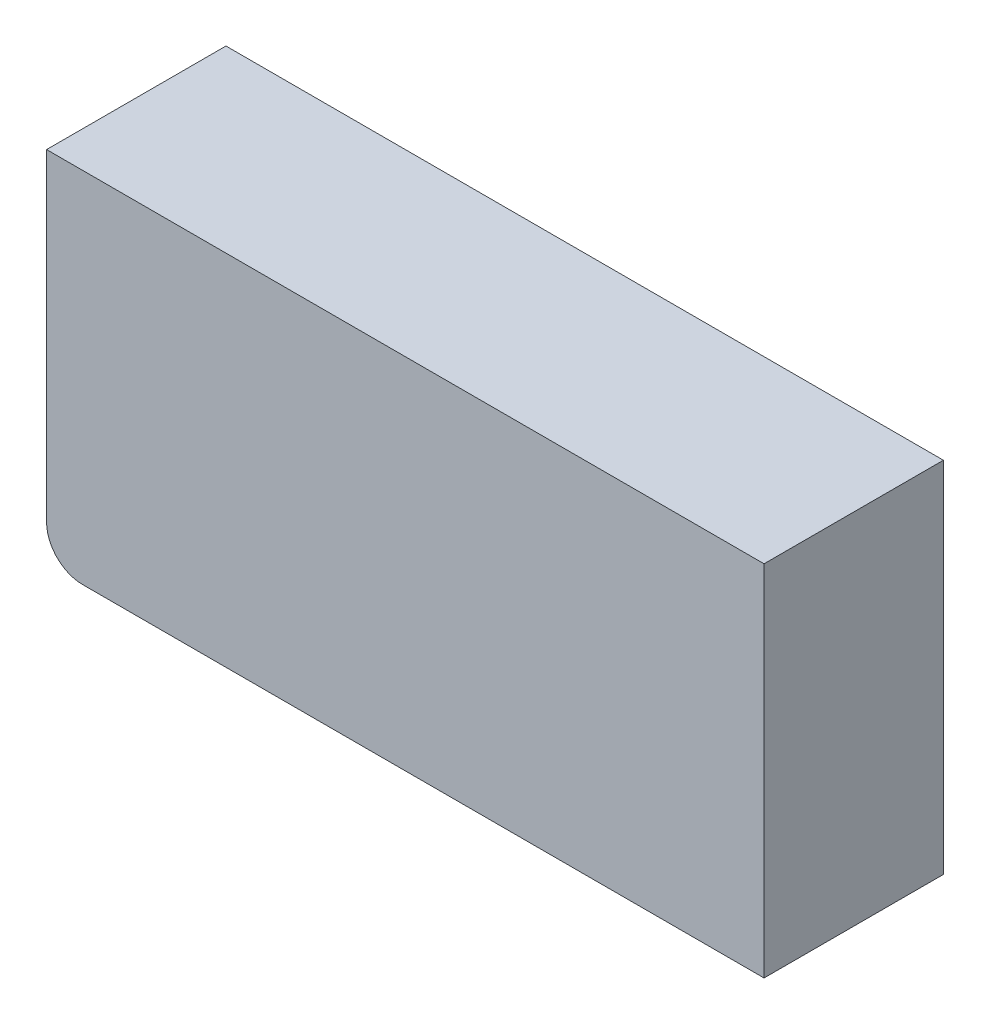
ISO-10303-21;
HEADER;
FILE_DESCRIPTION(('STEP AP214'),'2;1');
FILE_NAME('part.step','',(''),(''),'','','');
FILE_SCHEMA(('AUTOMOTIVE_DESIGN { 1 0 10303 214 1 1 1 1 }'));
ENDSEC;
DATA;
#1=APPLICATION_CONTEXT('core data for automotive mechanical design processes');
#2=APPLICATION_PROTOCOL_DEFINITION('international standard','automotive_design',2000,#1);
#3=PRODUCT_CONTEXT('',#1,'mechanical');
#4=PRODUCT('Part','Part','',(#3));
#5=PRODUCT_RELATED_PRODUCT_CATEGORY('part','',(#4));
#6=PRODUCT_DEFINITION_FORMATION('','',#4);
#7=PRODUCT_DEFINITION_CONTEXT('part definition',#1,'design');
#8=PRODUCT_DEFINITION('design','',#6,#7);
#9=PRODUCT_DEFINITION_SHAPE('','',#8);
#10=(LENGTH_UNIT() NAMED_UNIT(*) SI_UNIT(.MILLI.,.METRE.));
#11=(NAMED_UNIT(*) PLANE_ANGLE_UNIT() SI_UNIT($,.RADIAN.));
#12=(NAMED_UNIT(*) SI_UNIT($,.STERADIAN.) SOLID_ANGLE_UNIT());
#13=UNCERTAINTY_MEASURE_WITH_UNIT(LENGTH_MEASURE(1.E-05),#10,'distance_accuracy_value','');
#14=(GEOMETRIC_REPRESENTATION_CONTEXT(3) GLOBAL_UNCERTAINTY_ASSIGNED_CONTEXT((#13)) GLOBAL_UNIT_ASSIGNED_CONTEXT((#10,
#11,#12)) REPRESENTATION_CONTEXT('',''));
#15=CARTESIAN_POINT('',(0.,0.,0.));
#16=DIRECTION('',(0.,0.,1.));
#17=DIRECTION('',(1.,0.,0.));
#18=AXIS2_PLACEMENT_3D('',#15,#16,#17);
#19=CARTESIAN_POINT('',(0.,20.,10.));
#20=DIRECTION('',(1.,0.,0.));
#21=DIRECTION('',(0.,0.,-1.));
#22=AXIS2_PLACEMENT_3D('',#19,#20,#21);
#23=PLANE('',#22);
#24=DIRECTION('',(0.,-1.,0.));
#25=VECTOR('',#24,1.);
#26=CARTESIAN_POINT('',(0.,20.,0.));
#27=LINE('',#26,#25);
#28=CARTESIAN_POINT('',(0.,20.,0.));
#29=VERTEX_POINT('',#28);
#30=CARTESIAN_POINT('',(0.,2.,0.));
#31=VERTEX_POINT('',#30);
#32=EDGE_CURVE('E117',#29,#31,#27,.T.);
#33=ORIENTED_EDGE('',*,*,#32,.T.);
#34=DIRECTION('',(0.,0.,-1.));
#35=VECTOR('',#34,1.);
#36=CARTESIAN_POINT('',(0.,2.,10.));
#37=LINE('',#36,#35);
#38=CARTESIAN_POINT('',(0.,2.,10.));
#39=VERTEX_POINT('',#38);
#40=EDGE_CURVE('E49',#31,#39,#37,.F.);
#41=ORIENTED_EDGE('',*,*,#40,.T.);
#42=DIRECTION('',(0.,-1.,0.));
#43=VECTOR('',#42,1.);
#44=CARTESIAN_POINT('',(0.,20.,10.));
#45=LINE('',#44,#43);
#46=CARTESIAN_POINT('',(0.,20.,10.));
#47=VERTEX_POINT('',#46);
#48=EDGE_CURVE('E97',#47,#39,#45,.T.);
#49=ORIENTED_EDGE('',*,*,#48,.F.);
#50=DIRECTION('',(0.,0.,-1.));
#51=VECTOR('',#50,1.);
#52=CARTESIAN_POINT('',(0.,20.,10.));
#53=LINE('',#52,#51);
#54=EDGE_CURVE('E113',#47,#29,#53,.T.);
#55=ORIENTED_EDGE('',*,*,#54,.T.);
#56=EDGE_LOOP('',(#33,#41,#49,#55));
#57=FACE_BOUND('',#56,.T.);
#58=ADVANCED_FACE('F41',(#57),#23,.F.);
#59=CARTESIAN_POINT('',(0.,0.,10.));
#60=DIRECTION('',(0.,1.,0.));
#61=DIRECTION('',(0.,0.,1.));
#62=AXIS2_PLACEMENT_3D('',#59,#60,#61);
#63=PLANE('',#62);
#64=DIRECTION('',(1.,0.,0.));
#65=VECTOR('',#64,1.);
#66=CARTESIAN_POINT('',(0.,0.,10.));
#67=LINE('',#66,#65);
#68=CARTESIAN_POINT('',(2.,0.,10.));
#69=VERTEX_POINT('',#68);
#70=CARTESIAN_POINT('',(40.,0.,10.));
#71=VERTEX_POINT('',#70);
#72=EDGE_CURVE('E87',#69,#71,#67,.T.);
#73=ORIENTED_EDGE('',*,*,#72,.F.);
#74=DIRECTION('',(0.,0.,-1.));
#75=VECTOR('',#74,1.);
#76=CARTESIAN_POINT('',(2.,0.,10.));
#77=LINE('',#76,#75);
#78=CARTESIAN_POINT('',(2.,0.,0.));
#79=VERTEX_POINT('',#78);
#80=EDGE_CURVE('E105',#69,#79,#77,.T.);
#81=ORIENTED_EDGE('',*,*,#80,.T.);
#82=DIRECTION('',(1.,0.,0.));
#83=VECTOR('',#82,1.);
#84=CARTESIAN_POINT('',(0.,0.,0.));
#85=LINE('',#84,#83);
#86=CARTESIAN_POINT('',(40.,0.,0.));
#87=VERTEX_POINT('',#86);
#88=EDGE_CURVE('E102',#79,#87,#85,.T.);
#89=ORIENTED_EDGE('',*,*,#88,.T.);
#90=DIRECTION('',(0.,0.,-1.));
#91=VECTOR('',#90,1.);
#92=CARTESIAN_POINT('',(40.,0.,10.));
#93=LINE('',#92,#91);
#94=EDGE_CURVE('E100',#71,#87,#93,.T.);
#95=ORIENTED_EDGE('',*,*,#94,.F.);
#96=EDGE_LOOP('',(#73,#81,#89,#95));
#97=FACE_BOUND('',#96,.T.);
#98=ADVANCED_FACE('F101',(#97),#63,.F.);
#99=CARTESIAN_POINT('',(40.,0.,10.));
#100=DIRECTION('',(-1.,0.,0.));
#101=DIRECTION('',(0.,0.,1.));
#102=AXIS2_PLACEMENT_3D('',#99,#100,#101);
#103=PLANE('',#102);
#104=DIRECTION('',(0.,1.,0.));
#105=VECTOR('',#104,1.);
#106=CARTESIAN_POINT('',(40.,0.,0.));
#107=LINE('',#106,#105);
#108=CARTESIAN_POINT('',(40.,20.,0.));
#109=VERTEX_POINT('',#108);
#110=EDGE_CURVE('E120',#87,#109,#107,.T.);
#111=ORIENTED_EDGE('',*,*,#110,.T.);
#112=DIRECTION('',(0.,0.,-1.));
#113=VECTOR('',#112,1.);
#114=CARTESIAN_POINT('',(40.,20.,10.));
#115=LINE('',#114,#113);
#116=CARTESIAN_POINT('',(40.,20.,10.));
#117=VERTEX_POINT('',#116);
#118=EDGE_CURVE('E106',#117,#109,#115,.T.);
#119=ORIENTED_EDGE('',*,*,#118,.F.);
#120=DIRECTION('',(0.,1.,0.));
#121=VECTOR('',#120,1.);
#122=CARTESIAN_POINT('',(40.,0.,10.));
#123=LINE('',#122,#121);
#124=EDGE_CURVE('E91',#71,#117,#123,.T.);
#125=ORIENTED_EDGE('',*,*,#124,.F.);
#126=ORIENTED_EDGE('',*,*,#94,.T.);
#127=EDGE_LOOP('',(#111,#119,#125,#126));
#128=FACE_BOUND('',#127,.T.);
#129=ADVANCED_FACE('F108',(#128),#103,.F.);
#130=CARTESIAN_POINT('',(40.,20.,10.));
#131=DIRECTION('',(0.,-1.,0.));
#132=DIRECTION('',(0.,0.,-1.));
#133=AXIS2_PLACEMENT_3D('',#130,#131,#132);
#134=PLANE('',#133);
#135=DIRECTION('',(-1.,0.,0.));
#136=VECTOR('',#135,1.);
#137=CARTESIAN_POINT('',(40.,20.,0.));
#138=LINE('',#137,#136);
#139=EDGE_CURVE('E122',#109,#29,#138,.T.);
#140=ORIENTED_EDGE('',*,*,#139,.T.);
#141=ORIENTED_EDGE('',*,*,#54,.F.);
#142=DIRECTION('',(-1.,0.,0.));
#143=VECTOR('',#142,1.);
#144=CARTESIAN_POINT('',(40.,20.,10.));
#145=LINE('',#144,#143);
#146=EDGE_CURVE('E111',#117,#47,#145,.T.);
#147=ORIENTED_EDGE('',*,*,#146,.F.);
#148=ORIENTED_EDGE('',*,*,#118,.T.);
#149=EDGE_LOOP('',(#140,#141,#147,#148));
#150=FACE_BOUND('',#149,.T.);
#151=ADVANCED_FACE('F132',(#150),#134,.F.);
#152=CARTESIAN_POINT('',(0.,0.,10.));
#153=DIRECTION('',(0.,0.,1.));
#154=DIRECTION('',(1.,0.,0.));
#155=AXIS2_PLACEMENT_3D('',#152,#153,#154);
#156=PLANE('',#155);
#157=ORIENTED_EDGE('',*,*,#48,.T.);
#158=CARTESIAN_POINT('',(2.,2.,10.));
#159=DIRECTION('',(0.,0.,1.));
#160=DIRECTION('',(1.,0.,0.));
#161=AXIS2_PLACEMENT_3D('',#158,#159,#160);
#162=CIRCLE('',#161,2.);
#163=EDGE_CURVE('E11',#39,#69,#162,.T.);
#164=ORIENTED_EDGE('',*,*,#163,.T.);
#165=ORIENTED_EDGE('',*,*,#72,.T.);
#166=ORIENTED_EDGE('',*,*,#124,.T.);
#167=ORIENTED_EDGE('',*,*,#146,.T.);
#168=EDGE_LOOP('',(#157,#164,#165,#166,#167));
#169=FACE_BOUND('',#168,.T.);
#170=ADVANCED_FACE('F89',(#169),#156,.T.);
#171=CARTESIAN_POINT('',(0.,0.,0.));
#172=DIRECTION('',(0.,0.,1.));
#173=DIRECTION('',(1.,0.,0.));
#174=AXIS2_PLACEMENT_3D('',#171,#172,#173);
#175=PLANE('',#174);
#176=ORIENTED_EDGE('',*,*,#88,.F.);
#177=CARTESIAN_POINT('',(2.,2.,0.));
#178=DIRECTION('',(0.,0.,1.));
#179=DIRECTION('',(1.,0.,0.));
#180=AXIS2_PLACEMENT_3D('',#177,#178,#179);
#181=CIRCLE('',#180,2.);
#182=EDGE_CURVE('E63',#79,#31,#181,.F.);
#183=ORIENTED_EDGE('',*,*,#182,.T.);
#184=ORIENTED_EDGE('',*,*,#32,.F.);
#185=ORIENTED_EDGE('',*,*,#139,.F.);
#186=ORIENTED_EDGE('',*,*,#110,.F.);
#187=EDGE_LOOP('',(#176,#183,#184,#185,#186));
#188=FACE_BOUND('',#187,.T.);
#189=ADVANCED_FACE('F129',(#188),#175,.F.);
#190=CARTESIAN_POINT('',(2.,2.,10.));
#191=DIRECTION('',(0.,0.,-1.));
#192=DIRECTION('',(-1.,0.,0.));
#193=AXIS2_PLACEMENT_3D('',#190,#191,#192);
#194=CYLINDRICAL_SURFACE('',#193,2.);
#195=ORIENTED_EDGE('',*,*,#163,.F.);
#196=ORIENTED_EDGE('',*,*,#40,.F.);
#197=ORIENTED_EDGE('',*,*,#182,.F.);
#198=ORIENTED_EDGE('',*,*,#80,.F.);
#199=EDGE_LOOP('',(#195,#196,#197,#198));
#200=FACE_BOUND('',#199,.T.);
#201=ADVANCED_FACE('F43',(#200),#194,.T.);
#202=CLOSED_SHELL('',(#58,#98,#129,#151,#170,#189,#201));
#203=MANIFOLD_SOLID_BREP('B2',#202);
#204=ADVANCED_BREP_SHAPE_REPRESENTATION('',(#18,#203),#14);
#205=SHAPE_DEFINITION_REPRESENTATION(#9,#204);
ENDSEC;
END-ISO-10303-21;
